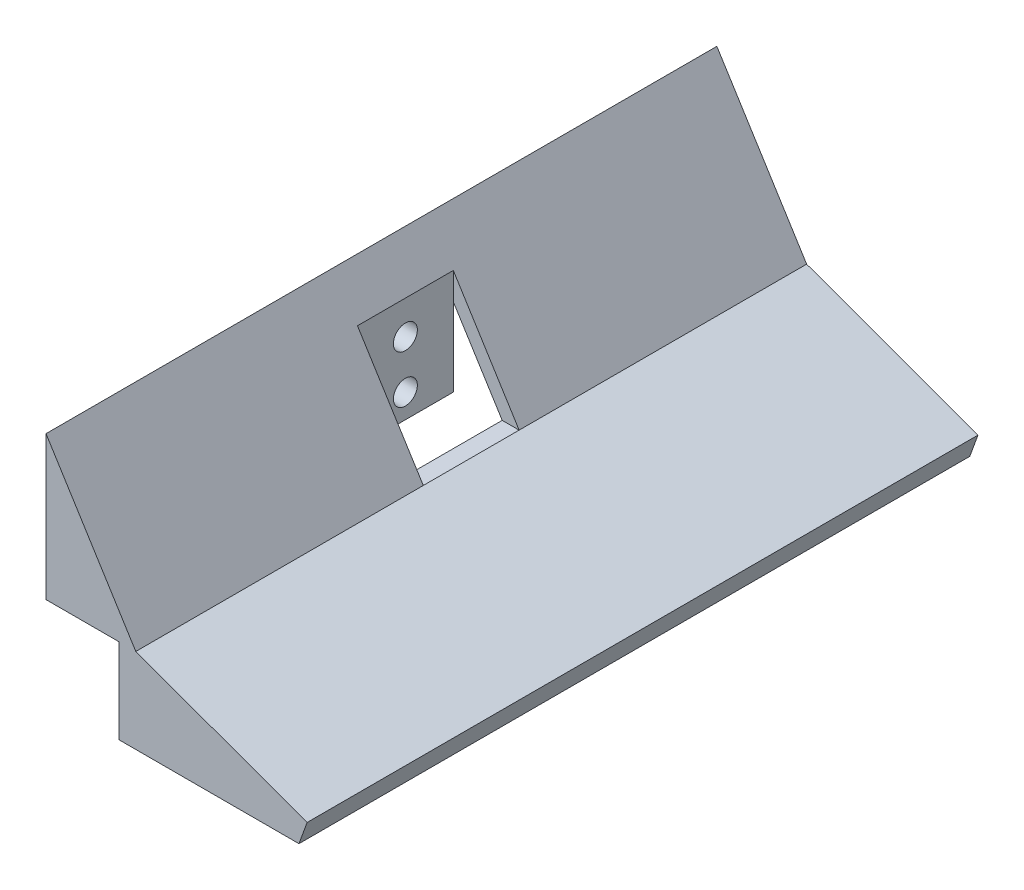
ISO-10303-21;
HEADER;
FILE_DESCRIPTION(('STEP AP214'),'2;1');
FILE_NAME('part.step','',(''),(''),'','','');
FILE_SCHEMA(('AUTOMOTIVE_DESIGN { 1 0 10303 214 1 1 1 1 }'));
ENDSEC;
DATA;
#1=APPLICATION_CONTEXT('core data for automotive mechanical design processes');
#2=APPLICATION_PROTOCOL_DEFINITION('international standard','automotive_design',2000,#1);
#3=PRODUCT_CONTEXT('',#1,'mechanical');
#4=PRODUCT('Part','Part','',(#3));
#5=PRODUCT_RELATED_PRODUCT_CATEGORY('part','',(#4));
#6=PRODUCT_DEFINITION_FORMATION('','',#4);
#7=PRODUCT_DEFINITION_CONTEXT('part definition',#1,'design');
#8=PRODUCT_DEFINITION('design','',#6,#7);
#9=PRODUCT_DEFINITION_SHAPE('','',#8);
#10=(LENGTH_UNIT() NAMED_UNIT(*) SI_UNIT(.MILLI.,.METRE.));
#11=(NAMED_UNIT(*) PLANE_ANGLE_UNIT() SI_UNIT($,.RADIAN.));
#12=(NAMED_UNIT(*) SI_UNIT($,.STERADIAN.) SOLID_ANGLE_UNIT());
#13=UNCERTAINTY_MEASURE_WITH_UNIT(LENGTH_MEASURE(1.E-05),#10,'distance_accuracy_value','');
#14=(GEOMETRIC_REPRESENTATION_CONTEXT(3) GLOBAL_UNCERTAINTY_ASSIGNED_CONTEXT((#13)) GLOBAL_UNIT_ASSIGNED_CONTEXT((#10,
#11,#12)) REPRESENTATION_CONTEXT('',''));
#15=CARTESIAN_POINT('',(0.,0.,0.));
#16=DIRECTION('',(0.,0.,1.));
#17=DIRECTION('',(1.,0.,0.));
#18=AXIS2_PLACEMENT_3D('',#15,#16,#17);
#19=CARTESIAN_POINT('',(-4.40504250795642,-12.1027548223479,0.));
#20=DIRECTION('',(0.342020143325673,0.939692620785907,0.));
#21=DIRECTION('',(-0.939692620785907,0.342020143325673,0.));
#22=AXIS2_PLACEMENT_3D('',#19,#20,#21);
#23=PLANE('',#22);
#24=DIRECTION('',(0.,0.,1.));
#25=VECTOR('',#24,1.);
#26=CARTESIAN_POINT('',(-4.39736103525932,-12.1055506497649,0.));
#27=LINE('',#26,#25);
#28=CARTESIAN_POINT('',(-4.39736103525932,-12.1055506497649,5.));
#29=VERTEX_POINT('',#28);
#30=CARTESIAN_POINT('',(-4.39736103525932,-12.1055506497649,135.));
#31=VERTEX_POINT('',#30);
#32=EDGE_CURVE('E49',#29,#31,#27,.T.);
#33=ORIENTED_EDGE('',*,*,#32,.F.);
#34=DIRECTION('',(0.939692620785907,-0.342020143325673,0.));
#35=VECTOR('',#34,1.);
#36=CARTESIAN_POINT('',(-4.40504250795642,-12.1027548223479,5.));
#37=LINE('',#36,#35);
#38=CARTESIAN_POINT('',(33.190343796177,-25.7863563827919,5.));
#39=VERTEX_POINT('',#38);
#40=EDGE_CURVE('E178',#29,#39,#37,.T.);
#41=ORIENTED_EDGE('',*,*,#40,.T.);
#42=DIRECTION('',(0.,0.,1.));
#43=VECTOR('',#42,1.);
#44=CARTESIAN_POINT('',(33.190343796177,-25.7863563827919,0.));
#45=LINE('',#44,#43);
#46=CARTESIAN_POINT('',(33.190343796177,-25.7863563827919,135.));
#47=VERTEX_POINT('',#46);
#48=EDGE_CURVE('E54',#39,#47,#45,.T.);
#49=ORIENTED_EDGE('',*,*,#48,.T.);
#50=DIRECTION('',(0.939692620785907,-0.342020143325673,0.));
#51=VECTOR('',#50,1.);
#52=CARTESIAN_POINT('',(-4.40504250795642,-12.1027548223479,135.));
#53=LINE('',#52,#51);
#54=EDGE_CURVE('E210',#31,#47,#53,.T.);
#55=ORIENTED_EDGE('',*,*,#54,.F.);
#56=EDGE_LOOP('',(#33,#41,#49,#55));
#57=FACE_BOUND('',#56,.T.);
#58=ADVANCED_FACE('F34',(#57),#23,.F.);
#59=CARTESIAN_POINT('',(-14.5973610352597,21.9279547026749,80.));
#60=DIRECTION('',(0.,0.,1.));
#61=DIRECTION('',(1.,0.,0.));
#62=AXIS2_PLACEMENT_3D('',#59,#60,#61);
#63=PLANE('',#62);
#64=DIRECTION('',(0.,1.,0.));
#65=VECTOR('',#64,1.);
#66=CARTESIAN_POINT('',(-14.5973610352597,21.9279547026749,80.));
#67=LINE('',#66,#65);
#68=CARTESIAN_POINT('',(-14.5973610352597,-8.07204529732491,80.));
#69=VERTEX_POINT('',#68);
#70=CARTESIAN_POINT('',(-14.5973610352597,8.25922796395658,80.));
#71=VERTEX_POINT('',#70);
#72=EDGE_CURVE('E397',#69,#71,#67,.T.);
#73=ORIENTED_EDGE('',*,*,#72,.T.);
#74=DIRECTION('',(-0.529735779441946,0.84816272258278,0.));
#75=VECTOR('',#74,1.);
#76=CARTESIAN_POINT('',(-19.5973610352596,16.2647540724279,80.));
#77=LINE('',#76,#75);
#78=CARTESIAN_POINT('',(-19.5973610352597,16.2647540724279,80.));
#79=VERTEX_POINT('',#78);
#80=EDGE_CURVE('E264',#71,#79,#77,.T.);
#81=ORIENTED_EDGE('',*,*,#80,.T.);
#82=DIRECTION('',(0.,1.,0.));
#83=VECTOR('',#82,1.);
#84=CARTESIAN_POINT('',(-19.5973610352597,21.9279547026749,80.));
#85=LINE('',#84,#83);
#86=CARTESIAN_POINT('',(-19.5973610352597,-8.07204529732491,80.));
#87=VERTEX_POINT('',#86);
#88=EDGE_CURVE('E269',#87,#79,#85,.T.);
#89=ORIENTED_EDGE('',*,*,#88,.F.);
#90=DIRECTION('',(-1.,0.,0.));
#91=VECTOR('',#90,1.);
#92=CARTESIAN_POINT('',(-14.5973610352597,-8.07204529732491,80.));
#93=LINE('',#92,#91);
#94=EDGE_CURVE('E394',#69,#87,#93,.T.);
#95=ORIENTED_EDGE('',*,*,#94,.F.);
#96=EDGE_LOOP('',(#73,#81,#89,#95));
#97=FACE_BOUND('',#96,.T.);
#98=ADVANCED_FACE('F304',(#97),#63,.T.);
#99=CARTESIAN_POINT('',(-19.5973610352597,21.9279547026749,5.));
#100=DIRECTION('',(1.,0.,0.));
#101=DIRECTION('',(0.,0.,-1.));
#102=AXIS2_PLACEMENT_3D('',#99,#100,#101);
#103=PLANE('',#102);
#104=CARTESIAN_POINT('',(-19.5973610352597,6.92795470267502,69.999999999996));
#105=DIRECTION('',(-1.,0.,0.));
#106=DIRECTION('',(0.,0.,1.));
#107=AXIS2_PLACEMENT_3D('',#104,#105,#106);
#108=CIRCLE('',#107,2.49999999999994);
#109=CARTESIAN_POINT('',(-19.5973610352597,6.92795470267502,72.499999999996));
#110=VERTEX_POINT('',#109);
#111=EDGE_CURVE('E246',#110,#110,#108,.T.);
#112=ORIENTED_EDGE('',*,*,#111,.F.);
#113=EDGE_LOOP('',(#112));
#114=FACE_BOUND('',#113,.T.);
#115=CARTESIAN_POINT('',(-19.5973610352597,-3.07204529733054,69.999999999996));
#116=DIRECTION('',(-1.,0.,0.));
#117=DIRECTION('',(0.,0.,1.));
#118=AXIS2_PLACEMENT_3D('',#115,#116,#117);
#119=CIRCLE('',#118,2.49999999999995);
#120=CARTESIAN_POINT('',(-19.5973610352597,-3.07204529733054,72.499999999996));
#121=VERTEX_POINT('',#120);
#122=EDGE_CURVE('E250',#121,#121,#119,.T.);
#123=ORIENTED_EDGE('',*,*,#122,.F.);
#124=EDGE_LOOP('',(#123));
#125=FACE_BOUND('',#124,.T.);
#126=DIRECTION('',(0.,0.,1.));
#127=VECTOR('',#126,1.);
#128=CARTESIAN_POINT('',(-19.5973610352597,16.2647540724279,0.));
#129=LINE('',#128,#127);
#130=CARTESIAN_POINT('',(-19.5973610352596,16.2647540724278,135.));
#131=VERTEX_POINT('',#130);
#132=EDGE_CURVE('E272',#79,#131,#129,.T.);
#133=ORIENTED_EDGE('',*,*,#132,.T.);
#134=DIRECTION('',(0.,-1.,0.));
#135=VECTOR('',#134,1.);
#136=CARTESIAN_POINT('',(-19.5973610352597,21.9279547026749,135.));
#137=LINE('',#136,#135);
#138=CARTESIAN_POINT('',(-19.5973610352593,-8.07204529733063,135.));
#139=VERTEX_POINT('',#138);
#140=EDGE_CURVE('E238',#131,#139,#137,.T.);
#141=ORIENTED_EDGE('',*,*,#140,.T.);
#142=DIRECTION('',(0.,0.,1.));
#143=VECTOR('',#142,1.);
#144=CARTESIAN_POINT('',(-19.5973610352593,-8.07204529733063,135.));
#145=LINE('',#144,#143);
#146=CARTESIAN_POINT('',(-19.5973610352593,-8.07204529733063,140.));
#147=VERTEX_POINT('',#146);
#148=EDGE_CURVE('E240',#139,#147,#145,.T.);
#149=ORIENTED_EDGE('',*,*,#148,.T.);
#150=DIRECTION('',(0.,-1.,0.));
#151=VECTOR('',#150,1.);
#152=CARTESIAN_POINT('',(-19.5973610352597,21.9279547026749,140.));
#153=LINE('',#152,#151);
#154=CARTESIAN_POINT('',(-19.5973610352597,21.9279547026749,140.));
#155=VERTEX_POINT('',#154);
#156=EDGE_CURVE('E451',#155,#147,#153,.T.);
#157=ORIENTED_EDGE('',*,*,#156,.F.);
#158=DIRECTION('',(0.,0.,-1.));
#159=VECTOR('',#158,1.);
#160=CARTESIAN_POINT('',(-19.5973610352597,21.9279547026749,5.));
#161=LINE('',#160,#159);
#162=CARTESIAN_POINT('',(-19.5973610352597,21.9279547026749,0.));
#163=VERTEX_POINT('',#162);
#164=EDGE_CURVE('E345',#155,#163,#161,.T.);
#165=ORIENTED_EDGE('',*,*,#164,.T.);
#166=DIRECTION('',(0.,-1.,0.));
#167=VECTOR('',#166,1.);
#168=CARTESIAN_POINT('',(-19.5973610352597,21.9279547026749,0.));
#169=LINE('',#168,#167);
#170=CARTESIAN_POINT('',(-19.5973610352597,-8.07204529732511,0.));
#171=VERTEX_POINT('',#170);
#172=EDGE_CURVE('E341',#163,#171,#169,.T.);
#173=ORIENTED_EDGE('',*,*,#172,.T.);
#174=DIRECTION('',(0.,0.,-1.));
#175=VECTOR('',#174,1.);
#176=CARTESIAN_POINT('',(-19.5973610352597,-8.07204529732511,5.));
#177=LINE('',#176,#175);
#178=CARTESIAN_POINT('',(-19.5973610352597,-8.07204529732511,5.));
#179=VERTEX_POINT('',#178);
#180=EDGE_CURVE('E343',#179,#171,#177,.T.);
#181=ORIENTED_EDGE('',*,*,#180,.F.);
#182=DIRECTION('',(0.,-1.,0.));
#183=VECTOR('',#182,1.);
#184=CARTESIAN_POINT('',(-19.5973610352597,21.9279547026749,5.));
#185=LINE('',#184,#183);
#186=CARTESIAN_POINT('',(-19.5973610352597,16.2647540724279,5.));
#187=VERTEX_POINT('',#186);
#188=EDGE_CURVE('E353',#187,#179,#185,.T.);
#189=ORIENTED_EDGE('',*,*,#188,.F.);
#190=DIRECTION('',(0.,0.,1.));
#191=VECTOR('',#190,1.);
#192=CARTESIAN_POINT('',(-19.5973610352597,16.2647540724279,0.));
#193=LINE('',#192,#191);
#194=CARTESIAN_POINT('',(-19.5973610352597,16.2647540724279,60.));
#195=VERTEX_POINT('',#194);
#196=EDGE_CURVE('E360',#187,#195,#193,.T.);
#197=ORIENTED_EDGE('',*,*,#196,.T.);
#198=DIRECTION('',(0.,-1.,0.));
#199=VECTOR('',#198,1.);
#200=CARTESIAN_POINT('',(-19.5973610352597,21.9279547026749,60.));
#201=LINE('',#200,#199);
#202=CARTESIAN_POINT('',(-19.5973610352597,-8.07204529732491,60.));
#203=VERTEX_POINT('',#202);
#204=EDGE_CURVE('E384',#195,#203,#201,.T.);
#205=ORIENTED_EDGE('',*,*,#204,.T.);
#206=DIRECTION('',(0.,0.,1.));
#207=VECTOR('',#206,1.);
#208=CARTESIAN_POINT('',(-19.5973610352597,-8.07204529732491,60.));
#209=LINE('',#208,#207);
#210=EDGE_CURVE('E380',#203,#87,#209,.T.);
#211=ORIENTED_EDGE('',*,*,#210,.T.);
#212=ORIENTED_EDGE('',*,*,#88,.T.);
#213=EDGE_LOOP('',(#133,#141,#149,#157,#165,#173,#181,#189,#197,#205,#211,#212));
#214=FACE_BOUND('',#213,.T.);
#215=ADVANCED_FACE('F36',(#114,#125,#214),#103,.F.);
#216=CARTESIAN_POINT('',(-19.5973610352597,-8.07204529732511,5.));
#217=DIRECTION('',(0.,1.,0.));
#218=DIRECTION('',(-1.,0.,0.));
#219=AXIS2_PLACEMENT_3D('',#216,#217,#218);
#220=PLANE('',#219);
#221=DIRECTION('',(1.,0.,0.));
#222=VECTOR('',#221,1.);
#223=CARTESIAN_POINT('',(-19.5973610352597,-8.07204529732511,0.));
#224=LINE('',#223,#222);
#225=CARTESIAN_POINT('',(-4.39736103525933,-8.07204529732491,0.));
#226=VERTEX_POINT('',#225);
#227=EDGE_CURVE('E401',#171,#226,#224,.T.);
#228=ORIENTED_EDGE('',*,*,#227,.T.);
#229=DIRECTION('',(0.,0.,1.));
#230=VECTOR('',#229,1.);
#231=CARTESIAN_POINT('',(-4.39736103525932,-8.07204529732491,0.));
#232=LINE('',#231,#230);
#233=CARTESIAN_POINT('',(-4.39736103525966,-8.07204529732491,5.));
#234=VERTEX_POINT('',#233);
#235=EDGE_CURVE('E234',#226,#234,#232,.T.);
#236=ORIENTED_EDGE('',*,*,#235,.T.);
#237=DIRECTION('',(1.,0.,0.));
#238=VECTOR('',#237,1.);
#239=CARTESIAN_POINT('',(-19.5973610352597,-8.07204529732511,5.));
#240=LINE('',#239,#238);
#241=EDGE_CURVE('E402',#179,#234,#240,.T.);
#242=ORIENTED_EDGE('',*,*,#241,.F.);
#243=ORIENTED_EDGE('',*,*,#180,.T.);
#244=EDGE_LOOP('',(#228,#236,#242,#243));
#245=FACE_BOUND('',#244,.T.);
#246=ADVANCED_FACE('F422',(#245),#220,.F.);
#247=CARTESIAN_POINT('',(0.,0.,5.));
#248=DIRECTION('',(0.,0.,-1.));
#249=DIRECTION('',(-1.,0.,0.));
#250=AXIS2_PLACEMENT_3D('',#247,#248,#249);
#251=PLANE('',#250);
#252=ORIENTED_EDGE('',*,*,#241,.T.);
#253=DIRECTION('',(-0.529735779441946,0.84816272258278,0.));
#254=VECTOR('',#253,1.);
#255=CARTESIAN_POINT('',(-6.79016083290309,-4.24092104684903,5.));
#256=LINE('',#255,#254);
#257=EDGE_CURVE('E406',#234,#187,#256,.T.);
#258=ORIENTED_EDGE('',*,*,#257,.T.);
#259=ORIENTED_EDGE('',*,*,#188,.T.);
#260=EDGE_LOOP('',(#252,#258,#259));
#261=FACE_BOUND('',#260,.T.);
#262=ADVANCED_FACE('F427',(#261),#251,.F.);
#263=CARTESIAN_POINT('',(0.,0.,0.));
#264=DIRECTION('',(0.,0.,-1.));
#265=DIRECTION('',(-1.,0.,0.));
#266=AXIS2_PLACEMENT_3D('',#263,#264,#265);
#267=PLANE('',#266);
#268=DIRECTION('',(-0.342020143325673,-0.939692620785907,0.));
#269=VECTOR('',#268,1.);
#270=CARTESIAN_POINT('',(37.5953863041334,-13.683601560444,0.));
#271=LINE('',#270,#269);
#272=CARTESIAN_POINT('',(34.9004445128053,-21.0878932788623,0.));
#273=VERTEX_POINT('',#272);
#274=CARTESIAN_POINT('',(33.190343796177,-25.7863563827919,0.));
#275=VERTEX_POINT('',#274);
#276=EDGE_CURVE('E217',#273,#275,#271,.T.);
#277=ORIENTED_EDGE('',*,*,#276,.T.);
#278=DIRECTION('',(-1.,0.,0.));
#279=VECTOR('',#278,1.);
#280=CARTESIAN_POINT('',(33.190343796177,-25.7863563827919,0.));
#281=LINE('',#280,#279);
#282=CARTESIAN_POINT('',(-4.39736103525943,-25.7863563827919,0.));
#283=VERTEX_POINT('',#282);
#284=EDGE_CURVE('E192',#275,#283,#281,.T.);
#285=ORIENTED_EDGE('',*,*,#284,.T.);
#286=DIRECTION('',(0.,-1.,0.));
#287=VECTOR('',#286,1.);
#288=CARTESIAN_POINT('',(-4.39736103525932,0.,0.));
#289=LINE('',#288,#287);
#290=EDGE_CURVE('E215',#226,#283,#289,.T.);
#291=ORIENTED_EDGE('',*,*,#290,.F.);
#292=ORIENTED_EDGE('',*,*,#227,.F.);
#293=ORIENTED_EDGE('',*,*,#172,.F.);
#294=DIRECTION('',(-0.529735779441945,0.84816272258278,0.));
#295=VECTOR('',#294,1.);
#296=CARTESIAN_POINT('',(-19.5973610352597,21.9279547026749,0.));
#297=LINE('',#296,#295);
#298=CARTESIAN_POINT('',(-0.860303911522183,-8.07204529732491,0.));
#299=VERTEX_POINT('',#298);
#300=EDGE_CURVE('E352',#299,#163,#297,.T.);
#301=ORIENTED_EDGE('',*,*,#300,.F.);
#302=DIRECTION('',(0.939692620785907,-0.342020143325673,0.));
#303=VECTOR('',#302,1.);
#304=CARTESIAN_POINT('',(-2.69494179132806,-7.40429171841831,0.));
#305=LINE('',#304,#303);
#306=EDGE_CURVE('E220',#299,#273,#305,.T.);
#307=ORIENTED_EDGE('',*,*,#306,.T.);
#308=EDGE_LOOP('',(#277,#285,#291,#292,#293,#301,#307));
#309=FACE_BOUND('',#308,.T.);
#310=ADVANCED_FACE('F415',(#309),#267,.T.);
#311=CARTESIAN_POINT('',(-19.5973610352597,16.2647540724279,0.));
#312=DIRECTION('',(-0.84816272258278,-0.529735779441946,0.));
#313=DIRECTION('',(0.529735779441946,-0.84816272258278,0.));
#314=AXIS2_PLACEMENT_3D('',#311,#312,#313);
#315=PLANE('',#314);
#316=DIRECTION('',(0.529735779441946,-0.84816272258278,0.));
#317=VECTOR('',#316,1.);
#318=CARTESIAN_POINT('',(-19.5973610352597,16.2647540724279,60.));
#319=LINE('',#318,#317);
#320=CARTESIAN_POINT('',(-14.5973610352597,8.25922796395658,60.));
#321=VERTEX_POINT('',#320);
#322=EDGE_CURVE('E354',#195,#321,#319,.T.);
#323=ORIENTED_EDGE('',*,*,#322,.F.);
#324=ORIENTED_EDGE('',*,*,#196,.F.);
#325=ORIENTED_EDGE('',*,*,#257,.F.);
#326=DIRECTION('',(0.,0.,1.));
#327=VECTOR('',#326,1.);
#328=CARTESIAN_POINT('',(-4.39736103525966,-8.07204529732491,0.));
#329=LINE('',#328,#327);
#330=CARTESIAN_POINT('',(-4.39736103525932,-8.07204529732491,60.));
#331=VERTEX_POINT('',#330);
#332=EDGE_CURVE('E350',#234,#331,#329,.T.);
#333=ORIENTED_EDGE('',*,*,#332,.T.);
#334=EDGE_CURVE('E359',#321,#331,#319,.T.);
#335=ORIENTED_EDGE('',*,*,#334,.F.);
#336=EDGE_LOOP('',(#323,#324,#325,#333,#335));
#337=FACE_BOUND('',#336,.T.);
#338=ADVANCED_FACE('F430',(#337),#315,.T.);
#339=CARTESIAN_POINT('',(-19.5973610352597,21.9279547026749,0.));
#340=DIRECTION('',(0.84816272258278,0.529735779441945,0.));
#341=DIRECTION('',(-0.529735779441945,0.84816272258278,0.));
#342=AXIS2_PLACEMENT_3D('',#339,#340,#341);
#343=PLANE('',#342);
#344=ORIENTED_EDGE('',*,*,#300,.T.);
#345=ORIENTED_EDGE('',*,*,#164,.F.);
#346=DIRECTION('',(-0.529735779441945,0.84816272258278,0.));
#347=VECTOR('',#346,1.);
#348=CARTESIAN_POINT('',(-19.5973610352597,21.9279547026749,140.));
#349=LINE('',#348,#347);
#350=CARTESIAN_POINT('',(-0.860303911522183,-8.07204529732491,140.));
#351=VERTEX_POINT('',#350);
#352=EDGE_CURVE('E276',#351,#155,#349,.T.);
#353=ORIENTED_EDGE('',*,*,#352,.F.);
#354=DIRECTION('',(0.,0.,1.));
#355=VECTOR('',#354,1.);
#356=CARTESIAN_POINT('',(-0.860303911522183,-8.07204529732491,0.));
#357=LINE('',#356,#355);
#358=CARTESIAN_POINT('',(-0.860303911522182,-8.07204529732492,80.));
#359=VERTEX_POINT('',#358);
#360=EDGE_CURVE('E387',#359,#351,#357,.T.);
#361=ORIENTED_EDGE('',*,*,#360,.F.);
#362=DIRECTION('',(0.529735779441945,-0.84816272258278,0.));
#363=VECTOR('',#362,1.);
#364=CARTESIAN_POINT('',(-19.5973610352597,21.9279547026749,80.));
#365=LINE('',#364,#363);
#366=CARTESIAN_POINT('',(-14.5973610352597,13.9224285942036,80.));
#367=VERTEX_POINT('',#366);
#368=EDGE_CURVE('E254',#367,#359,#365,.T.);
#369=ORIENTED_EDGE('',*,*,#368,.F.);
#370=DIRECTION('',(0.,0.,1.));
#371=VECTOR('',#370,1.);
#372=CARTESIAN_POINT('',(-14.5973610352597,13.9224285942036,0.));
#373=LINE('',#372,#371);
#374=CARTESIAN_POINT('',(-14.5973610352597,13.9224285942036,60.));
#375=VERTEX_POINT('',#374);
#376=EDGE_CURVE('E42',#375,#367,#373,.T.);
#377=ORIENTED_EDGE('',*,*,#376,.F.);
#378=DIRECTION('',(-0.529735779441946,0.84816272258278,0.));
#379=VECTOR('',#378,1.);
#380=CARTESIAN_POINT('',(-19.5973610352597,21.9279547026749,60.));
#381=LINE('',#380,#379);
#382=CARTESIAN_POINT('',(-0.860303911522183,-8.07204529732491,60.));
#383=VERTEX_POINT('',#382);
#384=EDGE_CURVE('E358',#383,#375,#381,.T.);
#385=ORIENTED_EDGE('',*,*,#384,.F.);
#386=DIRECTION('',(0.,0.,1.));
#387=VECTOR('',#386,1.);
#388=CARTESIAN_POINT('',(-0.860303911522183,-8.07204529732491,0.));
#389=LINE('',#388,#387);
#390=EDGE_CURVE('E335',#299,#383,#389,.T.);
#391=ORIENTED_EDGE('',*,*,#390,.F.);
#392=EDGE_LOOP('',(#344,#345,#353,#361,#369,#377,#385,#391));
#393=FACE_BOUND('',#392,.T.);
#394=ADVANCED_FACE('F410',(#393),#343,.T.);
#395=CARTESIAN_POINT('',(-134.099328583935,-49.5863755219878,60.));
#396=DIRECTION('',(0.,0.,-1.));
#397=DIRECTION('',(-1.,0.,0.));
#398=AXIS2_PLACEMENT_3D('',#395,#396,#397);
#399=PLANE('',#398);
#400=ORIENTED_EDGE('',*,*,#384,.T.);
#401=DIRECTION('',(0.,-1.,0.));
#402=VECTOR('',#401,1.);
#403=CARTESIAN_POINT('',(-14.5973610352597,21.9279547026749,60.));
#404=LINE('',#403,#402);
#405=EDGE_CURVE('E268',#375,#321,#404,.T.);
#406=ORIENTED_EDGE('',*,*,#405,.T.);
#407=ORIENTED_EDGE('',*,*,#334,.T.);
#408=DIRECTION('',(-1.,0.,0.));
#409=VECTOR('',#408,1.);
#410=CARTESIAN_POINT('',(-19.5973610352597,-8.07204529732511,60.));
#411=LINE('',#410,#409);
#412=EDGE_CURVE('E330',#383,#331,#411,.T.);
#413=ORIENTED_EDGE('',*,*,#412,.F.);
#414=EDGE_LOOP('',(#400,#406,#407,#413));
#415=FACE_BOUND('',#414,.T.);
#416=ADVANCED_FACE('F431',(#415),#399,.F.);
#417=CARTESIAN_POINT('',(-14.5973610352597,21.9279547026749,60.));
#418=DIRECTION('',(0.,0.,-1.));
#419=DIRECTION('',(-1.,0.,0.));
#420=AXIS2_PLACEMENT_3D('',#417,#418,#419);
#421=PLANE('',#420);
#422=ORIENTED_EDGE('',*,*,#204,.F.);
#423=ORIENTED_EDGE('',*,*,#322,.T.);
#424=CARTESIAN_POINT('',(-14.5973610352597,-8.07204529732491,60.));
#425=VERTEX_POINT('',#424);
#426=EDGE_CURVE('E368',#321,#425,#404,.T.);
#427=ORIENTED_EDGE('',*,*,#426,.T.);
#428=DIRECTION('',(-1.,0.,0.));
#429=VECTOR('',#428,1.);
#430=CARTESIAN_POINT('',(-14.5973610352597,-8.07204529732491,60.));
#431=LINE('',#430,#429);
#432=EDGE_CURVE('E396',#425,#203,#431,.T.);
#433=ORIENTED_EDGE('',*,*,#432,.T.);
#434=EDGE_LOOP('',(#422,#423,#427,#433));
#435=FACE_BOUND('',#434,.T.);
#436=ADVANCED_FACE('F439',(#435),#421,.T.);
#437=CARTESIAN_POINT('',(-14.5973610352597,-8.07204529732491,60.));
#438=DIRECTION('',(0.,-1.,0.));
#439=DIRECTION('',(0.,0.,-1.));
#440=AXIS2_PLACEMENT_3D('',#437,#438,#439);
#441=PLANE('',#440);
#442=ORIENTED_EDGE('',*,*,#210,.F.);
#443=ORIENTED_EDGE('',*,*,#432,.F.);
#444=DIRECTION('',(0.,0.,1.));
#445=VECTOR('',#444,1.);
#446=CARTESIAN_POINT('',(-14.5973610352597,-8.07204529732491,60.));
#447=LINE('',#446,#445);
#448=EDGE_CURVE('E373',#425,#69,#447,.T.);
#449=ORIENTED_EDGE('',*,*,#448,.T.);
#450=ORIENTED_EDGE('',*,*,#94,.T.);
#451=EDGE_LOOP('',(#442,#443,#449,#450));
#452=FACE_BOUND('',#451,.T.);
#453=ADVANCED_FACE('F442',(#452),#441,.T.);
#454=CARTESIAN_POINT('',(-14.5973610352597,0.,0.));
#455=DIRECTION('',(-1.,0.,0.));
#456=DIRECTION('',(0.,0.,1.));
#457=AXIS2_PLACEMENT_3D('',#454,#455,#456);
#458=PLANE('',#457);
#459=CARTESIAN_POINT('',(-14.5973610352597,6.92795470267502,69.999999999996));
#460=DIRECTION('',(-1.,0.,0.));
#461=DIRECTION('',(0.,0.,1.));
#462=AXIS2_PLACEMENT_3D('',#459,#460,#461);
#463=CIRCLE('',#462,2.49999999999994);
#464=CARTESIAN_POINT('',(-14.5973610352597,6.92795470267502,72.499999999996));
#465=VERTEX_POINT('',#464);
#466=EDGE_CURVE('E249',#465,#465,#463,.T.);
#467=ORIENTED_EDGE('',*,*,#466,.T.);
#468=EDGE_LOOP('',(#467));
#469=FACE_BOUND('',#468,.T.);
#470=CARTESIAN_POINT('',(-14.5973610352597,-3.07204529733054,69.999999999996));
#471=DIRECTION('',(-1.,0.,0.));
#472=DIRECTION('',(0.,0.,1.));
#473=AXIS2_PLACEMENT_3D('',#470,#471,#472);
#474=CIRCLE('',#473,2.49999999999995);
#475=CARTESIAN_POINT('',(-14.5973610352597,-3.07204529733054,72.499999999996));
#476=VERTEX_POINT('',#475);
#477=EDGE_CURVE('E253',#476,#476,#474,.T.);
#478=ORIENTED_EDGE('',*,*,#477,.T.);
#479=EDGE_LOOP('',(#478));
#480=FACE_BOUND('',#479,.T.);
#481=ORIENTED_EDGE('',*,*,#405,.F.);
#482=ORIENTED_EDGE('',*,*,#376,.T.);
#483=EDGE_CURVE('E378',#71,#367,#67,.T.);
#484=ORIENTED_EDGE('',*,*,#483,.F.);
#485=ORIENTED_EDGE('',*,*,#72,.F.);
#486=ORIENTED_EDGE('',*,*,#448,.F.);
#487=ORIENTED_EDGE('',*,*,#426,.F.);
#488=EDGE_LOOP('',(#481,#482,#484,#485,#486,#487));
#489=FACE_BOUND('',#488,.T.);
#490=ADVANCED_FACE('F284',(#469,#480,#489),#458,.F.);
#491=CARTESIAN_POINT('',(-134.099328583935,-49.5863755219878,80.));
#492=DIRECTION('',(0.,0.,1.));
#493=DIRECTION('',(0.,-1.,0.));
#494=AXIS2_PLACEMENT_3D('',#491,#492,#493);
#495=PLANE('',#494);
#496=CARTESIAN_POINT('',(-4.39736103525932,-8.07204529732491,80.));
#497=VERTEX_POINT('',#496);
#498=EDGE_CURVE('E257',#497,#71,#77,.T.);
#499=ORIENTED_EDGE('',*,*,#498,.T.);
#500=ORIENTED_EDGE('',*,*,#483,.T.);
#501=ORIENTED_EDGE('',*,*,#368,.T.);
#502=DIRECTION('',(1.,0.,0.));
#503=VECTOR('',#502,1.);
#504=CARTESIAN_POINT('',(-19.5973610352596,-8.07204529732511,80.));
#505=LINE('',#504,#503);
#506=EDGE_CURVE('E261',#497,#359,#505,.T.);
#507=ORIENTED_EDGE('',*,*,#506,.F.);
#508=EDGE_LOOP('',(#499,#500,#501,#507));
#509=FACE_BOUND('',#508,.T.);
#510=ADVANCED_FACE('F450',(#509),#495,.F.);
#511=CARTESIAN_POINT('',(0.,0.,140.));
#512=DIRECTION('',(0.,0.,-1.));
#513=DIRECTION('',(-1.,0.,0.));
#514=AXIS2_PLACEMENT_3D('',#511,#512,#513);
#515=PLANE('',#514);
#516=DIRECTION('',(1.,0.,0.));
#517=VECTOR('',#516,1.);
#518=CARTESIAN_POINT('',(-0.860303911522183,-8.07204529732491,140.));
#519=LINE('',#518,#517);
#520=CARTESIAN_POINT('',(-4.39736103525932,-8.07204529732491,140.));
#521=VERTEX_POINT('',#520);
#522=EDGE_CURVE('E452',#147,#521,#519,.T.);
#523=ORIENTED_EDGE('',*,*,#522,.T.);
#524=DIRECTION('',(0.,-1.,0.));
#525=VECTOR('',#524,1.);
#526=CARTESIAN_POINT('',(-4.39736103525932,0.,140.));
#527=LINE('',#526,#525);
#528=CARTESIAN_POINT('',(-4.3973610352593,-25.7863563827919,140.));
#529=VERTEX_POINT('',#528);
#530=EDGE_CURVE('E214',#521,#529,#527,.T.);
#531=ORIENTED_EDGE('',*,*,#530,.T.);
#532=DIRECTION('',(1.,0.,0.));
#533=VECTOR('',#532,1.);
#534=CARTESIAN_POINT('',(33.190343796177,-25.7863563827919,140.));
#535=LINE('',#534,#533);
#536=CARTESIAN_POINT('',(33.190343796177,-25.7863563827919,140.));
#537=VERTEX_POINT('',#536);
#538=EDGE_CURVE('E183',#529,#537,#535,.T.);
#539=ORIENTED_EDGE('',*,*,#538,.T.);
#540=DIRECTION('',(-0.342020143325673,-0.939692620785907,0.));
#541=VECTOR('',#540,1.);
#542=CARTESIAN_POINT('',(37.5953863041334,-13.683601560444,140.));
#543=LINE('',#542,#541);
#544=CARTESIAN_POINT('',(34.9004445128053,-21.0878932788623,140.));
#545=VERTEX_POINT('',#544);
#546=EDGE_CURVE('E224',#545,#537,#543,.T.);
#547=ORIENTED_EDGE('',*,*,#546,.F.);
#548=DIRECTION('',(0.939692620785907,-0.342020143325673,0.));
#549=VECTOR('',#548,1.);
#550=CARTESIAN_POINT('',(-2.69494179132806,-7.40429171841831,140.));
#551=LINE('',#550,#549);
#552=EDGE_CURVE('E218',#351,#545,#551,.T.);
#553=ORIENTED_EDGE('',*,*,#552,.F.);
#554=ORIENTED_EDGE('',*,*,#352,.T.);
#555=ORIENTED_EDGE('',*,*,#156,.T.);
#556=EDGE_LOOP('',(#523,#531,#539,#547,#553,#554,#555));
#557=FACE_BOUND('',#556,.T.);
#558=ADVANCED_FACE('F462',(#557),#515,.F.);
#559=CARTESIAN_POINT('',(-19.5973610352597,16.2647540724279,0.));
#560=DIRECTION('',(-0.84816272258278,-0.529735779441946,0.));
#561=DIRECTION('',(0.529735779441946,-0.84816272258278,0.));
#562=AXIS2_PLACEMENT_3D('',#559,#560,#561);
#563=PLANE('',#562);
#564=DIRECTION('',(0.529735779441946,-0.84816272258278,0.));
#565=VECTOR('',#564,1.);
#566=CARTESIAN_POINT('',(-19.5973610352597,16.2647540724279,135.));
#567=LINE('',#566,#565);
#568=CARTESIAN_POINT('',(-4.39736103525932,-8.07204529732491,135.));
#569=VERTEX_POINT('',#568);
#570=EDGE_CURVE('E243',#131,#569,#567,.T.);
#571=ORIENTED_EDGE('',*,*,#570,.F.);
#572=ORIENTED_EDGE('',*,*,#132,.F.);
#573=ORIENTED_EDGE('',*,*,#80,.F.);
#574=ORIENTED_EDGE('',*,*,#498,.F.);
#575=DIRECTION('',(0.,0.,1.));
#576=VECTOR('',#575,1.);
#577=CARTESIAN_POINT('',(-4.39736103525966,-8.07204529732491,0.));
#578=LINE('',#577,#576);
#579=EDGE_CURVE('E275',#497,#569,#578,.T.);
#580=ORIENTED_EDGE('',*,*,#579,.T.);
#581=EDGE_LOOP('',(#571,#572,#573,#574,#580));
#582=FACE_BOUND('',#581,.T.);
#583=ADVANCED_FACE('F447',(#582),#563,.T.);
#584=CARTESIAN_POINT('',(-19.5973610352597,-8.07204529732511,5.));
#585=DIRECTION('',(0.,1.,0.));
#586=DIRECTION('',(-1.,0.,0.));
#587=AXIS2_PLACEMENT_3D('',#584,#585,#586);
#588=PLANE('',#587);
#589=DIRECTION('',(1.,3.05151899738627E-13,0.));
#590=VECTOR('',#589,1.);
#591=CARTESIAN_POINT('',(-19.5973610352593,-8.07204529733063,135.));
#592=LINE('',#591,#590);
#593=EDGE_CURVE('E230',#139,#569,#592,.T.);
#594=ORIENTED_EDGE('',*,*,#593,.T.);
#595=DIRECTION('',(0.,0.,1.));
#596=VECTOR('',#595,1.);
#597=CARTESIAN_POINT('',(-4.39736103525932,-8.07204529732491,5.));
#598=LINE('',#597,#596);
#599=EDGE_CURVE('E11',#569,#521,#598,.T.);
#600=ORIENTED_EDGE('',*,*,#599,.T.);
#601=ORIENTED_EDGE('',*,*,#522,.F.);
#602=ORIENTED_EDGE('',*,*,#148,.F.);
#603=EDGE_LOOP('',(#594,#600,#601,#602));
#604=FACE_BOUND('',#603,.T.);
#605=ADVANCED_FACE('F300',(#604),#588,.F.);
#606=CARTESIAN_POINT('',(58.4026389647403,-3.07204529733054,69.999999999996));
#607=DIRECTION('',(-1.,0.,0.));
#608=DIRECTION('',(0.,0.,1.));
#609=AXIS2_PLACEMENT_3D('',#606,#607,#608);
#610=CYLINDRICAL_SURFACE('',#609,2.49999999999995);
#611=ORIENTED_EDGE('',*,*,#122,.T.);
#612=EDGE_LOOP('',(#611));
#613=FACE_BOUND('',#612,.T.);
#614=ORIENTED_EDGE('',*,*,#477,.F.);
#615=EDGE_LOOP('',(#614));
#616=FACE_BOUND('',#615,.T.);
#617=ADVANCED_FACE('F290',(#613,#616),#610,.F.);
#618=CARTESIAN_POINT('',(58.4026389647403,6.92795470267502,69.999999999996));
#619=DIRECTION('',(-1.,0.,0.));
#620=DIRECTION('',(0.,0.,1.));
#621=AXIS2_PLACEMENT_3D('',#618,#619,#620);
#622=CYLINDRICAL_SURFACE('',#621,2.49999999999994);
#623=ORIENTED_EDGE('',*,*,#111,.T.);
#624=EDGE_LOOP('',(#623));
#625=FACE_BOUND('',#624,.T.);
#626=ORIENTED_EDGE('',*,*,#466,.F.);
#627=EDGE_LOOP('',(#626));
#628=FACE_BOUND('',#627,.T.);
#629=ADVANCED_FACE('F287',(#625,#628),#622,.F.);
#630=CARTESIAN_POINT('',(0.,0.,135.));
#631=DIRECTION('',(0.,0.,-1.));
#632=DIRECTION('',(-1.,0.,0.));
#633=AXIS2_PLACEMENT_3D('',#630,#631,#632);
#634=PLANE('',#633);
#635=ORIENTED_EDGE('',*,*,#140,.F.);
#636=ORIENTED_EDGE('',*,*,#570,.T.);
#637=ORIENTED_EDGE('',*,*,#593,.F.);
#638=EDGE_LOOP('',(#635,#636,#637));
#639=FACE_BOUND('',#638,.T.);
#640=ADVANCED_FACE('F289',(#639),#634,.T.);
#641=CARTESIAN_POINT('',(0.,-8.07204529732491,0.));
#642=DIRECTION('',(0.,-1.,0.));
#643=DIRECTION('',(0.,0.,-1.));
#644=AXIS2_PLACEMENT_3D('',#641,#642,#643);
#645=PLANE('',#644);
#646=DIRECTION('',(0.,0.,1.));
#647=VECTOR('',#646,1.);
#648=CARTESIAN_POINT('',(-0.860303911522182,-8.07204529732492,0.));
#649=LINE('',#648,#647);
#650=EDGE_CURVE('E227',#383,#359,#649,.T.);
#651=ORIENTED_EDGE('',*,*,#650,.F.);
#652=ORIENTED_EDGE('',*,*,#412,.T.);
#653=EDGE_CURVE('E222',#331,#497,#232,.T.);
#654=ORIENTED_EDGE('',*,*,#653,.T.);
#655=ORIENTED_EDGE('',*,*,#506,.T.);
#656=EDGE_LOOP('',(#651,#652,#654,#655));
#657=FACE_BOUND('',#656,.T.);
#658=ADVANCED_FACE('F297',(#657),#645,.F.);
#659=CARTESIAN_POINT('',(-2.69494179132806,-7.40429171841831,0.));
#660=DIRECTION('',(-0.342020143325673,-0.939692620785907,0.));
#661=DIRECTION('',(0.939692620785907,-0.342020143325673,0.));
#662=AXIS2_PLACEMENT_3D('',#659,#660,#661);
#663=PLANE('',#662);
#664=ORIENTED_EDGE('',*,*,#552,.T.);
#665=DIRECTION('',(0.,0.,1.));
#666=VECTOR('',#665,1.);
#667=CARTESIAN_POINT('',(34.9004445128053,-21.0878932788623,0.));
#668=LINE('',#667,#666);
#669=EDGE_CURVE('E193',#273,#545,#668,.T.);
#670=ORIENTED_EDGE('',*,*,#669,.F.);
#671=ORIENTED_EDGE('',*,*,#306,.F.);
#672=ORIENTED_EDGE('',*,*,#390,.T.);
#673=ORIENTED_EDGE('',*,*,#650,.T.);
#674=ORIENTED_EDGE('',*,*,#360,.T.);
#675=EDGE_LOOP('',(#664,#670,#671,#672,#673,#674));
#676=FACE_BOUND('',#675,.T.);
#677=ADVANCED_FACE('F320',(#676),#663,.F.);
#678=CARTESIAN_POINT('',(37.5953863041334,-13.683601560444,0.));
#679=DIRECTION('',(-0.939692620785907,0.342020143325673,0.));
#680=DIRECTION('',(-0.342020143325673,-0.939692620785907,0.));
#681=AXIS2_PLACEMENT_3D('',#678,#679,#680);
#682=PLANE('',#681);
#683=ORIENTED_EDGE('',*,*,#546,.T.);
#684=DIRECTION('',(0.,0.,1.));
#685=VECTOR('',#684,1.);
#686=CARTESIAN_POINT('',(33.190343796177,-25.7863563827919,135.));
#687=LINE('',#686,#685);
#688=EDGE_CURVE('E175',#47,#537,#687,.T.);
#689=ORIENTED_EDGE('',*,*,#688,.F.);
#690=ORIENTED_EDGE('',*,*,#48,.F.);
#691=EDGE_CURVE('E172',#275,#39,#45,.T.);
#692=ORIENTED_EDGE('',*,*,#691,.F.);
#693=ORIENTED_EDGE('',*,*,#276,.F.);
#694=ORIENTED_EDGE('',*,*,#669,.T.);
#695=EDGE_LOOP('',(#683,#689,#690,#692,#693,#694));
#696=FACE_BOUND('',#695,.T.);
#697=ADVANCED_FACE('F169',(#696),#682,.F.);
#698=CARTESIAN_POINT('',(-4.39736103525932,0.,0.));
#699=DIRECTION('',(-1.,0.,0.));
#700=DIRECTION('',(0.,0.,1.));
#701=AXIS2_PLACEMENT_3D('',#698,#699,#700);
#702=PLANE('',#701);
#703=ORIENTED_EDGE('',*,*,#290,.T.);
#704=DIRECTION('',(0.,0.,-1.));
#705=VECTOR('',#704,1.);
#706=CARTESIAN_POINT('',(-4.39736103525943,-25.7863563827919,5.));
#707=LINE('',#706,#705);
#708=CARTESIAN_POINT('',(-4.39736103525943,-25.7863563827919,5.));
#709=VERTEX_POINT('',#708);
#710=EDGE_CURVE('E184',#709,#283,#707,.T.);
#711=ORIENTED_EDGE('',*,*,#710,.F.);
#712=DIRECTION('',(0.,1.,0.));
#713=VECTOR('',#712,1.);
#714=CARTESIAN_POINT('',(-4.39736103525943,-25.7863563827919,5.));
#715=LINE('',#714,#713);
#716=EDGE_CURVE('E195',#709,#29,#715,.T.);
#717=ORIENTED_EDGE('',*,*,#716,.T.);
#718=ORIENTED_EDGE('',*,*,#32,.T.);
#719=DIRECTION('',(0.,-1.,0.));
#720=VECTOR('',#719,1.);
#721=CARTESIAN_POINT('',(-4.3973610352593,-25.7863563827919,135.));
#722=LINE('',#721,#720);
#723=CARTESIAN_POINT('',(-4.3973610352593,-25.7863563827919,135.));
#724=VERTEX_POINT('',#723);
#725=EDGE_CURVE('E201',#31,#724,#722,.T.);
#726=ORIENTED_EDGE('',*,*,#725,.T.);
#727=DIRECTION('',(0.,0.,1.));
#728=VECTOR('',#727,1.);
#729=CARTESIAN_POINT('',(-4.3973610352593,-25.7863563827919,135.));
#730=LINE('',#729,#728);
#731=EDGE_CURVE('E206',#724,#529,#730,.T.);
#732=ORIENTED_EDGE('',*,*,#731,.T.);
#733=ORIENTED_EDGE('',*,*,#530,.F.);
#734=ORIENTED_EDGE('',*,*,#599,.F.);
#735=ORIENTED_EDGE('',*,*,#579,.F.);
#736=ORIENTED_EDGE('',*,*,#653,.F.);
#737=ORIENTED_EDGE('',*,*,#332,.F.);
#738=ORIENTED_EDGE('',*,*,#235,.F.);
#739=EDGE_LOOP('',(#703,#711,#717,#718,#726,#732,#733,#734,#735,#736,#737,#738));
#740=FACE_BOUND('',#739,.T.);
#741=ADVANCED_FACE('F314',(#740),#702,.T.);
#742=CARTESIAN_POINT('',(0.,0.,135.));
#743=DIRECTION('',(0.,0.,1.));
#744=DIRECTION('',(1.,0.,0.));
#745=AXIS2_PLACEMENT_3D('',#742,#743,#744);
#746=PLANE('',#745);
#747=ORIENTED_EDGE('',*,*,#725,.F.);
#748=ORIENTED_EDGE('',*,*,#54,.T.);
#749=DIRECTION('',(1.,0.,0.));
#750=VECTOR('',#749,1.);
#751=CARTESIAN_POINT('',(33.190343796177,-25.7863563827919,135.));
#752=LINE('',#751,#750);
#753=EDGE_CURVE('E203',#724,#47,#752,.T.);
#754=ORIENTED_EDGE('',*,*,#753,.F.);
#755=EDGE_LOOP('',(#747,#748,#754));
#756=FACE_BOUND('',#755,.T.);
#757=ADVANCED_FACE('F317',(#756),#746,.F.);
#758=CARTESIAN_POINT('',(33.190343796177,-25.7863563827919,135.));
#759=DIRECTION('',(0.,-1.,0.));
#760=DIRECTION('',(1.,0.,0.));
#761=AXIS2_PLACEMENT_3D('',#758,#759,#760);
#762=PLANE('',#761);
#763=ORIENTED_EDGE('',*,*,#538,.F.);
#764=ORIENTED_EDGE('',*,*,#731,.F.);
#765=ORIENTED_EDGE('',*,*,#753,.T.);
#766=ORIENTED_EDGE('',*,*,#688,.T.);
#767=EDGE_LOOP('',(#763,#764,#765,#766));
#768=FACE_BOUND('',#767,.T.);
#769=ADVANCED_FACE('F469',(#768),#762,.T.);
#770=CARTESIAN_POINT('',(0.,0.,5.));
#771=DIRECTION('',(0.,0.,1.));
#772=DIRECTION('',(1.,0.,0.));
#773=AXIS2_PLACEMENT_3D('',#770,#771,#772);
#774=PLANE('',#773);
#775=ORIENTED_EDGE('',*,*,#40,.F.);
#776=ORIENTED_EDGE('',*,*,#716,.F.);
#777=DIRECTION('',(-1.,0.,0.));
#778=VECTOR('',#777,1.);
#779=CARTESIAN_POINT('',(33.190343796177,-25.7863563827919,5.));
#780=LINE('',#779,#778);
#781=EDGE_CURVE('E190',#39,#709,#780,.T.);
#782=ORIENTED_EDGE('',*,*,#781,.F.);
#783=EDGE_LOOP('',(#775,#776,#782));
#784=FACE_BOUND('',#783,.T.);
#785=ADVANCED_FACE('F194',(#784),#774,.T.);
#786=CARTESIAN_POINT('',(33.190343796177,-25.7863563827919,5.));
#787=DIRECTION('',(0.,-1.,0.));
#788=DIRECTION('',(1.,0.,0.));
#789=AXIS2_PLACEMENT_3D('',#786,#787,#788);
#790=PLANE('',#789);
#791=ORIENTED_EDGE('',*,*,#284,.F.);
#792=ORIENTED_EDGE('',*,*,#691,.T.);
#793=ORIENTED_EDGE('',*,*,#781,.T.);
#794=ORIENTED_EDGE('',*,*,#710,.T.);
#795=EDGE_LOOP('',(#791,#792,#793,#794));
#796=FACE_BOUND('',#795,.T.);
#797=ADVANCED_FACE('F188',(#796),#790,.T.);
#798=CLOSED_SHELL('',(#58,#98,#215,#246,#262,#310,#338,#394,#416,#436,#453,#490,#510,#558,#583,
#605,#617,#629,#640,#658,#677,#697,#741,#757,#769,#785,#797));
#799=MANIFOLD_SOLID_BREP('B2',#798);
#800=ADVANCED_BREP_SHAPE_REPRESENTATION('',(#18,#799),#14);
#801=SHAPE_DEFINITION_REPRESENTATION(#9,#800);
ENDSEC;
END-ISO-10303-21;
